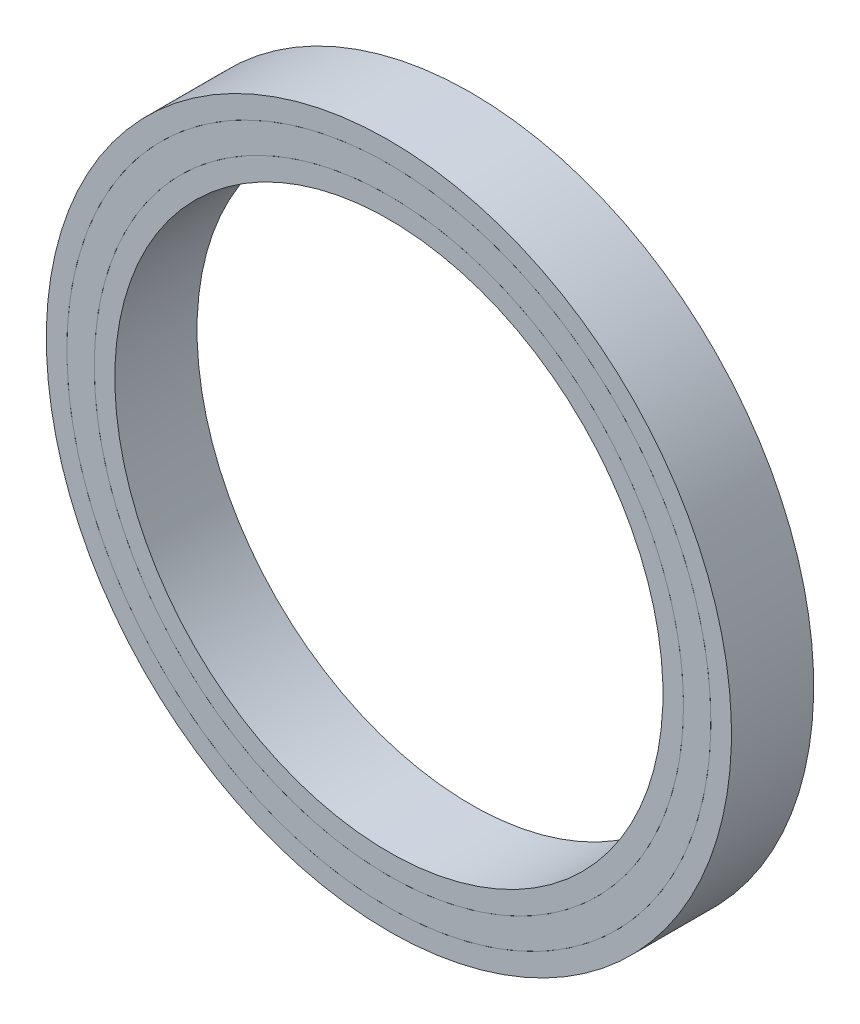
ISO-10303-21;
HEADER;
FILE_DESCRIPTION(('STEP AP214'),'2;1');
FILE_NAME('part.step','',(''),(''),'','','');
FILE_SCHEMA(('AUTOMOTIVE_DESIGN { 1 0 10303 214 1 1 1 1 }'));
ENDSEC;
DATA;
#1=APPLICATION_CONTEXT('core data for automotive mechanical design processes');
#2=APPLICATION_PROTOCOL_DEFINITION('international standard','automotive_design',2000,#1);
#3=PRODUCT_CONTEXT('',#1,'mechanical');
#4=PRODUCT('Part','Part','',(#3));
#5=PRODUCT_RELATED_PRODUCT_CATEGORY('part','',(#4));
#6=PRODUCT_DEFINITION_FORMATION('','',#4);
#7=PRODUCT_DEFINITION_CONTEXT('part definition',#1,'design');
#8=PRODUCT_DEFINITION('design','',#6,#7);
#9=PRODUCT_DEFINITION_SHAPE('','',#8);
#10=(LENGTH_UNIT() NAMED_UNIT(*) SI_UNIT(.MILLI.,.METRE.));
#11=(NAMED_UNIT(*) PLANE_ANGLE_UNIT() SI_UNIT($,.RADIAN.));
#12=(NAMED_UNIT(*) SI_UNIT($,.STERADIAN.) SOLID_ANGLE_UNIT());
#13=UNCERTAINTY_MEASURE_WITH_UNIT(LENGTH_MEASURE(1.E-05),#10,'distance_accuracy_value','');
#14=(GEOMETRIC_REPRESENTATION_CONTEXT(3) GLOBAL_UNCERTAINTY_ASSIGNED_CONTEXT((#13)) GLOBAL_UNIT_ASSIGNED_CONTEXT((#10,
#11,#12)) REPRESENTATION_CONTEXT('',''));
#15=CARTESIAN_POINT('',(0.,0.,0.));
#16=DIRECTION('',(0.,0.,1.));
#17=DIRECTION('',(1.,0.,0.));
#18=AXIS2_PLACEMENT_3D('',#15,#16,#17);
#19=CARTESIAN_POINT('',(77.125,0.,45.5));
#20=DIRECTION('',(0.,0.,1.));
#21=DIRECTION('',(-0.845678859505673,0.533692108415689,0.));
#22=AXIS2_PLACEMENT_3D('',#19,#20,#21);
#23=PLANE('',#22);
#24=CARTESIAN_POINT('',(77.125,0.,45.5));
#25=DIRECTION('',(0.,0.,-1.));
#26=DIRECTION('',(-0.845678859505673,0.533692108415689,0.));
#27=AXIS2_PLACEMENT_3D('',#24,#25,#26);
#28=CIRCLE('',#27,23.5);
#29=CARTESIAN_POINT('',(96.9984531983833,-12.5417645477687,45.5));
#30=VERTEX_POINT('',#29);
#31=EDGE_CURVE('E104',#30,#30,#28,.T.);
#32=ORIENTED_EDGE('',*,*,#31,.F.);
#33=EDGE_LOOP('',(#32));
#34=FACE_BOUND('',#33,.T.);
#35=CARTESIAN_POINT('',(77.125,0.,45.5));
#36=DIRECTION('',(0.,0.,1.));
#37=DIRECTION('',(0.845678859505673,-0.533692108415689,0.));
#38=AXIS2_PLACEMENT_3D('',#35,#36,#37);
#39=CIRCLE('',#38,25.);
#40=CARTESIAN_POINT('',(55.9830285123582,13.3423027103922,45.5));
#41=VERTEX_POINT('',#40);
#42=EDGE_CURVE('E12',#41,#41,#39,.T.);
#43=ORIENTED_EDGE('',*,*,#42,.F.);
#44=EDGE_LOOP('',(#43));
#45=FACE_BOUND('',#44,.T.);
#46=ADVANCED_FACE('F63',(#34,#45),#23,.F.);
#47=CARTESIAN_POINT('',(77.125,0.,51.5));
#48=DIRECTION('',(0.,0.,1.));
#49=DIRECTION('',(-0.845678859505673,0.533692108415689,0.));
#50=AXIS2_PLACEMENT_3D('',#47,#48,#49);
#51=PLANE('',#50);
#52=CARTESIAN_POINT('',(77.125,0.,51.5));
#53=DIRECTION('',(0.,0.,-1.));
#54=DIRECTION('',(-0.845678859505673,0.533692108415689,0.));
#55=AXIS2_PLACEMENT_3D('',#52,#53,#54);
#56=CIRCLE('',#55,23.5);
#57=CARTESIAN_POINT('',(96.9984531983833,-12.5417645477687,51.5));
#58=VERTEX_POINT('',#57);
#59=EDGE_CURVE('E102',#58,#58,#56,.T.);
#60=ORIENTED_EDGE('',*,*,#59,.T.);
#61=EDGE_LOOP('',(#60));
#62=FACE_BOUND('',#61,.T.);
#63=CARTESIAN_POINT('',(77.125,0.,51.5));
#64=DIRECTION('',(0.,0.,1.));
#65=DIRECTION('',(0.845678859505673,-0.533692108415689,0.));
#66=AXIS2_PLACEMENT_3D('',#63,#64,#65);
#67=CIRCLE('',#66,25.);
#68=CARTESIAN_POINT('',(55.9830285123582,13.3423027103922,51.5));
#69=VERTEX_POINT('',#68);
#70=EDGE_CURVE('E113',#69,#69,#67,.T.);
#71=ORIENTED_EDGE('',*,*,#70,.T.);
#72=EDGE_LOOP('',(#71));
#73=FACE_BOUND('',#72,.T.);
#74=ADVANCED_FACE('F107',(#62,#73),#51,.T.);
#75=CARTESIAN_POINT('',(77.125,0.,45.5));
#76=DIRECTION('',(0.,0.,1.));
#77=DIRECTION('',(0.845678859505673,-0.533692108415689,0.));
#78=AXIS2_PLACEMENT_3D('',#75,#76,#77);
#79=CYLINDRICAL_SURFACE('',#78,25.);
#80=ORIENTED_EDGE('',*,*,#70,.F.);
#81=DIRECTION('',(0.,0.,-1.));
#82=VECTOR('',#81,1.);
#83=CARTESIAN_POINT('',(55.9830285123582,13.3423027103922,45.5));
#84=LINE('',#83,#82);
#85=EDGE_CURVE('E72',#69,#41,#84,.T.);
#86=ORIENTED_EDGE('',*,*,#85,.T.);
#87=ORIENTED_EDGE('',*,*,#42,.T.);
#88=ORIENTED_EDGE('',*,*,#85,.F.);
#89=EDGE_LOOP('',(#80,#86,#87,#88));
#90=FACE_BOUND('',#89,.T.);
#91=ADVANCED_FACE('F118',(#90),#79,.T.);
#92=CARTESIAN_POINT('',(77.125,0.,45.5));
#93=DIRECTION('',(0.,0.,1.));
#94=DIRECTION('',(-0.845678859505673,0.533692108415689,0.));
#95=AXIS2_PLACEMENT_3D('',#92,#93,#94);
#96=CYLINDRICAL_SURFACE('',#95,23.5);
#97=ORIENTED_EDGE('',*,*,#59,.F.);
#98=DIRECTION('',(0.,0.,-1.));
#99=VECTOR('',#98,1.);
#100=CARTESIAN_POINT('',(96.9984531983833,-12.5417645477687,45.5));
#101=LINE('',#100,#99);
#102=EDGE_CURVE('E97',#58,#30,#101,.T.);
#103=ORIENTED_EDGE('',*,*,#102,.T.);
#104=ORIENTED_EDGE('',*,*,#31,.T.);
#105=ORIENTED_EDGE('',*,*,#102,.F.);
#106=EDGE_LOOP('',(#97,#103,#104,#105));
#107=FACE_BOUND('',#106,.T.);
#108=ADVANCED_FACE('F99',(#107),#96,.F.);
#109=CLOSED_SHELL('',(#46,#74,#91,#108));
#110=MANIFOLD_SOLID_BREP('B2',#109);
#111=CARTESIAN_POINT('',(77.125,0.,45.5));
#112=DIRECTION('',(0.,0.,1.));
#113=DIRECTION('',(-0.845678859505673,0.533692108415689,0.));
#114=AXIS2_PLACEMENT_3D('',#111,#112,#113);
#115=PLANE('',#114);
#116=CARTESIAN_POINT('',(77.125,0.,45.5));
#117=DIRECTION('',(0.,0.,-1.));
#118=DIRECTION('',(-0.845678859505673,0.533692108415689,0.));
#119=AXIS2_PLACEMENT_3D('',#116,#117,#118);
#120=CIRCLE('',#119,20.);
#121=CARTESIAN_POINT('',(94.0385771901135,-10.6738421683138,45.5));
#122=VERTEX_POINT('',#121);
#123=EDGE_CURVE('E228',#122,#122,#120,.T.);
#124=ORIENTED_EDGE('',*,*,#123,.F.);
#125=EDGE_LOOP('',(#124));
#126=FACE_BOUND('',#125,.T.);
#127=CARTESIAN_POINT('',(77.125,0.,45.5));
#128=DIRECTION('',(0.,0.,1.));
#129=DIRECTION('',(0.845678859505673,-0.533692108415689,0.));
#130=AXIS2_PLACEMENT_3D('',#127,#128,#129);
#131=CIRCLE('',#130,21.5);
#132=CARTESIAN_POINT('',(58.942904520628,11.4743803309373,45.5));
#133=VERTEX_POINT('',#132);
#134=EDGE_CURVE('E62',#133,#133,#131,.T.);
#135=ORIENTED_EDGE('',*,*,#134,.F.);
#136=EDGE_LOOP('',(#135));
#137=FACE_BOUND('',#136,.T.);
#138=ADVANCED_FACE('F197',(#126,#137),#115,.F.);
#139=CARTESIAN_POINT('',(77.125,0.,51.5));
#140=DIRECTION('',(0.,0.,1.));
#141=DIRECTION('',(-0.845678859505673,0.533692108415689,0.));
#142=AXIS2_PLACEMENT_3D('',#139,#140,#141);
#143=PLANE('',#142);
#144=CARTESIAN_POINT('',(77.125,0.,51.5));
#145=DIRECTION('',(0.,0.,-1.));
#146=DIRECTION('',(-0.845678859505673,0.533692108415689,0.));
#147=AXIS2_PLACEMENT_3D('',#144,#145,#146);
#148=CIRCLE('',#147,20.);
#149=CARTESIAN_POINT('',(94.0385771901135,-10.6738421683138,51.5));
#150=VERTEX_POINT('',#149);
#151=EDGE_CURVE('E238',#150,#150,#148,.T.);
#152=ORIENTED_EDGE('',*,*,#151,.T.);
#153=EDGE_LOOP('',(#152));
#154=FACE_BOUND('',#153,.T.);
#155=CARTESIAN_POINT('',(77.125,0.,51.5));
#156=DIRECTION('',(0.,0.,1.));
#157=DIRECTION('',(0.845678859505673,-0.533692108415689,0.));
#158=AXIS2_PLACEMENT_3D('',#155,#156,#157);
#159=CIRCLE('',#158,21.5);
#160=CARTESIAN_POINT('',(58.942904520628,11.4743803309373,51.5));
#161=VERTEX_POINT('',#160);
#162=EDGE_CURVE('E200',#161,#161,#159,.T.);
#163=ORIENTED_EDGE('',*,*,#162,.T.);
#164=EDGE_LOOP('',(#163));
#165=FACE_BOUND('',#164,.T.);
#166=ADVANCED_FACE('F248',(#154,#165),#143,.T.);
#167=CARTESIAN_POINT('',(77.125,0.,45.5));
#168=DIRECTION('',(0.,0.,1.));
#169=DIRECTION('',(0.845678859505673,-0.533692108415689,0.));
#170=AXIS2_PLACEMENT_3D('',#167,#168,#169);
#171=CYLINDRICAL_SURFACE('',#170,21.5);
#172=ORIENTED_EDGE('',*,*,#162,.F.);
#173=DIRECTION('',(0.,0.,-1.));
#174=VECTOR('',#173,1.);
#175=CARTESIAN_POINT('',(58.942904520628,11.4743803309373,45.5));
#176=LINE('',#175,#174);
#177=EDGE_CURVE('E207',#161,#133,#176,.T.);
#178=ORIENTED_EDGE('',*,*,#177,.T.);
#179=ORIENTED_EDGE('',*,*,#134,.T.);
#180=ORIENTED_EDGE('',*,*,#177,.F.);
#181=EDGE_LOOP('',(#172,#178,#179,#180));
#182=FACE_BOUND('',#181,.T.);
#183=ADVANCED_FACE('F246',(#182),#171,.T.);
#184=CARTESIAN_POINT('',(77.125,0.,45.5));
#185=DIRECTION('',(0.,0.,1.));
#186=DIRECTION('',(-0.845678859505673,0.533692108415689,0.));
#187=AXIS2_PLACEMENT_3D('',#184,#185,#186);
#188=CYLINDRICAL_SURFACE('',#187,20.);
#189=ORIENTED_EDGE('',*,*,#151,.F.);
#190=DIRECTION('',(0.,0.,-1.));
#191=VECTOR('',#190,1.);
#192=CARTESIAN_POINT('',(94.0385771901135,-10.6738421683138,45.5));
#193=LINE('',#192,#191);
#194=EDGE_CURVE('E231',#150,#122,#193,.T.);
#195=ORIENTED_EDGE('',*,*,#194,.T.);
#196=ORIENTED_EDGE('',*,*,#123,.T.);
#197=ORIENTED_EDGE('',*,*,#194,.F.);
#198=EDGE_LOOP('',(#189,#195,#196,#197));
#199=FACE_BOUND('',#198,.T.);
#200=ADVANCED_FACE('F229',(#199),#188,.F.);
#201=CLOSED_SHELL('',(#138,#166,#183,#200));
#202=MANIFOLD_SOLID_BREP('B6',#201);
#203=CARTESIAN_POINT('',(77.125,0.,45.5));
#204=DIRECTION('',(0.,0.,1.));
#205=DIRECTION('',(-0.845678859505673,0.533692108415689,0.));
#206=AXIS2_PLACEMENT_3D('',#203,#204,#205);
#207=PLANE('',#206);
#208=CARTESIAN_POINT('',(77.125,0.,45.5));
#209=DIRECTION('',(0.,0.,-1.));
#210=DIRECTION('',(-0.845678859505673,0.533692108415689,0.));
#211=AXIS2_PLACEMENT_3D('',#208,#209,#210);
#212=CIRCLE('',#211,21.5);
#213=CARTESIAN_POINT('',(95.307095479372,-11.4743803309373,45.5));
#214=VERTEX_POINT('',#213);
#215=EDGE_CURVE('E359',#214,#214,#212,.T.);
#216=ORIENTED_EDGE('',*,*,#215,.F.);
#217=EDGE_LOOP('',(#216));
#218=FACE_BOUND('',#217,.T.);
#219=CARTESIAN_POINT('',(77.125,0.,45.5));
#220=DIRECTION('',(0.,0.,1.));
#221=DIRECTION('',(0.845678859505673,-0.533692108415689,0.));
#222=AXIS2_PLACEMENT_3D('',#219,#220,#221);
#223=CIRCLE('',#222,23.5);
#224=CARTESIAN_POINT('',(57.2515468016167,12.5417645477687,45.5));
#225=VERTEX_POINT('',#224);
#226=EDGE_CURVE('E193',#225,#225,#223,.T.);
#227=ORIENTED_EDGE('',*,*,#226,.F.);
#228=EDGE_LOOP('',(#227));
#229=FACE_BOUND('',#228,.T.);
#230=ADVANCED_FACE('F321',(#218,#229),#207,.F.);
#231=CARTESIAN_POINT('',(77.125,0.,51.5));
#232=DIRECTION('',(0.,0.,1.));
#233=DIRECTION('',(-0.845678859505673,0.533692108415689,0.));
#234=AXIS2_PLACEMENT_3D('',#231,#232,#233);
#235=PLANE('',#234);
#236=CARTESIAN_POINT('',(77.125,0.,51.5));
#237=DIRECTION('',(0.,0.,-1.));
#238=DIRECTION('',(-0.845678859505673,0.533692108415689,0.));
#239=AXIS2_PLACEMENT_3D('',#236,#237,#238);
#240=CIRCLE('',#239,21.5);
#241=CARTESIAN_POINT('',(95.307095479372,-11.4743803309373,51.5));
#242=VERTEX_POINT('',#241);
#243=EDGE_CURVE('E358',#242,#242,#240,.T.);
#244=ORIENTED_EDGE('',*,*,#243,.T.);
#245=EDGE_LOOP('',(#244));
#246=FACE_BOUND('',#245,.T.);
#247=CARTESIAN_POINT('',(77.125,0.,51.5));
#248=DIRECTION('',(0.,0.,1.));
#249=DIRECTION('',(0.845678859505673,-0.533692108415689,0.));
#250=AXIS2_PLACEMENT_3D('',#247,#248,#249);
#251=CIRCLE('',#250,23.5);
#252=CARTESIAN_POINT('',(57.2515468016167,12.5417645477687,51.5));
#253=VERTEX_POINT('',#252);
#254=EDGE_CURVE('E375',#253,#253,#251,.T.);
#255=ORIENTED_EDGE('',*,*,#254,.T.);
#256=EDGE_LOOP('',(#255));
#257=FACE_BOUND('',#256,.T.);
#258=ADVANCED_FACE('F362',(#246,#257),#235,.T.);
#259=CARTESIAN_POINT('',(77.125,0.,45.5));
#260=DIRECTION('',(0.,0.,1.));
#261=DIRECTION('',(0.845678859505673,-0.533692108415689,0.));
#262=AXIS2_PLACEMENT_3D('',#259,#260,#261);
#263=CYLINDRICAL_SURFACE('',#262,23.5);
#264=ORIENTED_EDGE('',*,*,#254,.F.);
#265=DIRECTION('',(0.,0.,-1.));
#266=VECTOR('',#265,1.);
#267=CARTESIAN_POINT('',(57.2515468016167,12.5417645477687,45.5));
#268=LINE('',#267,#266);
#269=EDGE_CURVE('E326',#253,#225,#268,.T.);
#270=ORIENTED_EDGE('',*,*,#269,.T.);
#271=ORIENTED_EDGE('',*,*,#226,.T.);
#272=ORIENTED_EDGE('',*,*,#269,.F.);
#273=EDGE_LOOP('',(#264,#270,#271,#272));
#274=FACE_BOUND('',#273,.T.);
#275=ADVANCED_FACE('F376',(#274),#263,.T.);
#276=CARTESIAN_POINT('',(77.125,0.,45.5));
#277=DIRECTION('',(0.,0.,1.));
#278=DIRECTION('',(-0.845678859505673,0.533692108415689,0.));
#279=AXIS2_PLACEMENT_3D('',#276,#277,#278);
#280=CYLINDRICAL_SURFACE('',#279,21.5);
#281=ORIENTED_EDGE('',*,*,#243,.F.);
#282=DIRECTION('',(0.,0.,-1.));
#283=VECTOR('',#282,1.);
#284=CARTESIAN_POINT('',(95.307095479372,-11.4743803309373,45.5));
#285=LINE('',#284,#283);
#286=EDGE_CURVE('E352',#242,#214,#285,.T.);
#287=ORIENTED_EDGE('',*,*,#286,.T.);
#288=ORIENTED_EDGE('',*,*,#215,.T.);
#289=ORIENTED_EDGE('',*,*,#286,.F.);
#290=EDGE_LOOP('',(#281,#287,#288,#289));
#291=FACE_BOUND('',#290,.T.);
#292=ADVANCED_FACE('F360',(#291),#280,.F.);
#293=CLOSED_SHELL('',(#230,#258,#275,#292));
#294=MANIFOLD_SOLID_BREP('B57',#293);
#295=ADVANCED_BREP_SHAPE_REPRESENTATION('',(#18,#110,#202,#294),#14);
#296=SHAPE_DEFINITION_REPRESENTATION(#9,#295);
ENDSEC;
END-ISO-10303-21;
